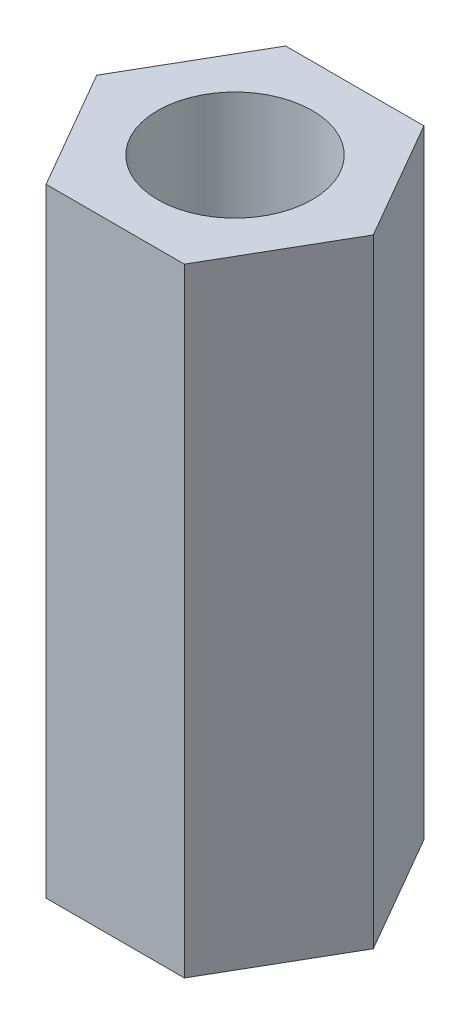
ISO-10303-21;
HEADER;
FILE_DESCRIPTION(('STEP AP214'),'2;1');
FILE_NAME('part.step','',(''),(''),'','','');
FILE_SCHEMA(('AUTOMOTIVE_DESIGN { 1 0 10303 214 1 1 1 1 }'));
ENDSEC;
DATA;
#1=APPLICATION_CONTEXT('core data for automotive mechanical design processes');
#2=APPLICATION_PROTOCOL_DEFINITION('international standard','automotive_design',2000,#1);
#3=PRODUCT_CONTEXT('',#1,'mechanical');
#4=PRODUCT('Part','Part','',(#3));
#5=PRODUCT_RELATED_PRODUCT_CATEGORY('part','',(#4));
#6=PRODUCT_DEFINITION_FORMATION('','',#4);
#7=PRODUCT_DEFINITION_CONTEXT('part definition',#1,'design');
#8=PRODUCT_DEFINITION('design','',#6,#7);
#9=PRODUCT_DEFINITION_SHAPE('','',#8);
#10=(LENGTH_UNIT() NAMED_UNIT(*) SI_UNIT(.MILLI.,.METRE.));
#11=(NAMED_UNIT(*) PLANE_ANGLE_UNIT() SI_UNIT($,.RADIAN.));
#12=(NAMED_UNIT(*) SI_UNIT($,.STERADIAN.) SOLID_ANGLE_UNIT());
#13=UNCERTAINTY_MEASURE_WITH_UNIT(LENGTH_MEASURE(1.E-05),#10,'distance_accuracy_value','');
#14=(GEOMETRIC_REPRESENTATION_CONTEXT(3) GLOBAL_UNCERTAINTY_ASSIGNED_CONTEXT((#13)) GLOBAL_UNIT_ASSIGNED_CONTEXT((#10,
#11,#12)) REPRESENTATION_CONTEXT('',''));
#15=CARTESIAN_POINT('',(0.,0.,0.));
#16=DIRECTION('',(0.,0.,1.));
#17=DIRECTION('',(1.,0.,0.));
#18=AXIS2_PLACEMENT_3D('',#15,#16,#17);
#19=CARTESIAN_POINT('',(0.,12.,0.));
#20=DIRECTION('',(0.,1.,0.));
#21=DIRECTION('',(0.,0.,1.));
#22=AXIS2_PLACEMENT_3D('',#19,#20,#21);
#23=PLANE('',#22);
#24=DIRECTION('',(0.5,0.,-0.866025403784439));
#25=VECTOR('',#24,1.);
#26=CARTESIAN_POINT('',(1.34233937586588,12.,2.325));
#27=LINE('',#26,#25);
#28=CARTESIAN_POINT('',(1.34233937586588,12.,2.325));
#29=VERTEX_POINT('',#28);
#30=CARTESIAN_POINT('',(2.68467875173176,12.,0.));
#31=VERTEX_POINT('',#30);
#32=EDGE_CURVE('E132',#29,#31,#27,.T.);
#33=ORIENTED_EDGE('',*,*,#32,.T.);
#34=DIRECTION('',(-0.5,0.,-0.866025403784438));
#35=VECTOR('',#34,1.);
#36=CARTESIAN_POINT('',(2.68467875173176,12.,0.));
#37=LINE('',#36,#35);
#38=CARTESIAN_POINT('',(1.34233937586588,12.,-2.325));
#39=VERTEX_POINT('',#38);
#40=EDGE_CURVE('E90',#31,#39,#37,.T.);
#41=ORIENTED_EDGE('',*,*,#40,.T.);
#42=DIRECTION('',(-1.,0.,0.));
#43=VECTOR('',#42,1.);
#44=CARTESIAN_POINT('',(1.34233937586588,12.,-2.325));
#45=LINE('',#44,#43);
#46=CARTESIAN_POINT('',(-1.34233937586588,12.,-2.325));
#47=VERTEX_POINT('',#46);
#48=EDGE_CURVE('E103',#39,#47,#45,.T.);
#49=ORIENTED_EDGE('',*,*,#48,.T.);
#50=DIRECTION('',(-0.5,0.,0.866025403784439));
#51=VECTOR('',#50,1.);
#52=CARTESIAN_POINT('',(-1.34233937586588,12.,-2.325));
#53=LINE('',#52,#51);
#54=CARTESIAN_POINT('',(-2.68467875173176,12.,0.));
#55=VERTEX_POINT('',#54);
#56=EDGE_CURVE('E97',#47,#55,#53,.T.);
#57=ORIENTED_EDGE('',*,*,#56,.T.);
#58=DIRECTION('',(0.5,0.,0.866025403784438));
#59=VECTOR('',#58,1.);
#60=CARTESIAN_POINT('',(-2.68467875173176,12.,0.));
#61=LINE('',#60,#59);
#62=CARTESIAN_POINT('',(-1.34233937586588,12.,2.325));
#63=VERTEX_POINT('',#62);
#64=EDGE_CURVE('E101',#55,#63,#61,.T.);
#65=ORIENTED_EDGE('',*,*,#64,.T.);
#66=DIRECTION('',(1.,0.,0.));
#67=VECTOR('',#66,1.);
#68=CARTESIAN_POINT('',(-1.34233937586588,12.,2.325));
#69=LINE('',#68,#67);
#70=EDGE_CURVE('E53',#63,#29,#69,.T.);
#71=ORIENTED_EDGE('',*,*,#70,.T.);
#72=EDGE_LOOP('',(#33,#41,#49,#57,#65,#71));
#73=FACE_BOUND('',#72,.T.);
#74=CARTESIAN_POINT('',(0.,12.,0.));
#75=DIRECTION('',(0.,1.,0.));
#76=DIRECTION('',(0.,0.,1.));
#77=AXIS2_PLACEMENT_3D('',#74,#75,#76);
#78=CIRCLE('',#77,1.5);
#79=CARTESIAN_POINT('',(0.,12.,1.5));
#80=VERTEX_POINT('',#79);
#81=EDGE_CURVE('E125',#80,#80,#78,.T.);
#82=ORIENTED_EDGE('',*,*,#81,.F.);
#83=EDGE_LOOP('',(#82));
#84=FACE_BOUND('',#83,.T.);
#85=ADVANCED_FACE('F36',(#73,#84),#23,.T.);
#86=CARTESIAN_POINT('',(0.,0.,0.));
#87=DIRECTION('',(0.,1.,0.));
#88=DIRECTION('',(0.,0.,1.));
#89=AXIS2_PLACEMENT_3D('',#86,#87,#88);
#90=PLANE('',#89);
#91=DIRECTION('',(0.5,0.,-0.866025403784439));
#92=VECTOR('',#91,1.);
#93=CARTESIAN_POINT('',(1.34233937586588,0.,2.325));
#94=LINE('',#93,#92);
#95=CARTESIAN_POINT('',(1.34233937586588,0.,2.325));
#96=VERTEX_POINT('',#95);
#97=CARTESIAN_POINT('',(2.68467875173176,0.,0.));
#98=VERTEX_POINT('',#97);
#99=EDGE_CURVE('E121',#96,#98,#94,.T.);
#100=ORIENTED_EDGE('',*,*,#99,.F.);
#101=DIRECTION('',(1.,0.,0.));
#102=VECTOR('',#101,1.);
#103=CARTESIAN_POINT('',(-1.34233937586588,0.,2.325));
#104=LINE('',#103,#102);
#105=CARTESIAN_POINT('',(-1.34233937586588,0.,2.325));
#106=VERTEX_POINT('',#105);
#107=EDGE_CURVE('E82',#106,#96,#104,.T.);
#108=ORIENTED_EDGE('',*,*,#107,.F.);
#109=DIRECTION('',(0.5,0.,0.866025403784438));
#110=VECTOR('',#109,1.);
#111=CARTESIAN_POINT('',(-2.68467875173176,0.,0.));
#112=LINE('',#111,#110);
#113=CARTESIAN_POINT('',(-2.68467875173176,0.,0.));
#114=VERTEX_POINT('',#113);
#115=EDGE_CURVE('E76',#114,#106,#112,.T.);
#116=ORIENTED_EDGE('',*,*,#115,.F.);
#117=DIRECTION('',(-0.5,0.,0.866025403784439));
#118=VECTOR('',#117,1.);
#119=CARTESIAN_POINT('',(-1.34233937586588,0.,-2.325));
#120=LINE('',#119,#118);
#121=CARTESIAN_POINT('',(-1.34233937586588,0.,-2.325));
#122=VERTEX_POINT('',#121);
#123=EDGE_CURVE('E111',#122,#114,#120,.T.);
#124=ORIENTED_EDGE('',*,*,#123,.F.);
#125=DIRECTION('',(-1.,0.,0.));
#126=VECTOR('',#125,1.);
#127=CARTESIAN_POINT('',(1.34233937586588,0.,-2.325));
#128=LINE('',#127,#126);
#129=CARTESIAN_POINT('',(1.34233937586588,0.,-2.325));
#130=VERTEX_POINT('',#129);
#131=EDGE_CURVE('E127',#130,#122,#128,.T.);
#132=ORIENTED_EDGE('',*,*,#131,.F.);
#133=DIRECTION('',(-0.5,0.,-0.866025403784438));
#134=VECTOR('',#133,1.);
#135=CARTESIAN_POINT('',(2.68467875173176,0.,0.));
#136=LINE('',#135,#134);
#137=EDGE_CURVE('E124',#98,#130,#136,.T.);
#138=ORIENTED_EDGE('',*,*,#137,.F.);
#139=EDGE_LOOP('',(#100,#108,#116,#124,#132,#138));
#140=FACE_BOUND('',#139,.T.);
#141=CARTESIAN_POINT('',(0.,0.,0.));
#142=DIRECTION('',(0.,1.,0.));
#143=DIRECTION('',(0.,0.,1.));
#144=AXIS2_PLACEMENT_3D('',#141,#142,#143);
#145=CIRCLE('',#144,1.5);
#146=CARTESIAN_POINT('',(0.,0.,1.5));
#147=VERTEX_POINT('',#146);
#148=EDGE_CURVE('E227',#147,#147,#145,.T.);
#149=ORIENTED_EDGE('',*,*,#148,.T.);
#150=EDGE_LOOP('',(#149));
#151=FACE_BOUND('',#150,.T.);
#152=ADVANCED_FACE('F141',(#140,#151),#90,.F.);
#153=CARTESIAN_POINT('',(1.34233937586588,12.,2.325));
#154=DIRECTION('',(-0.866025403784439,0.,-0.5));
#155=DIRECTION('',(-0.5,0.,0.866025403784439));
#156=AXIS2_PLACEMENT_3D('',#153,#154,#155);
#157=PLANE('',#156);
#158=ORIENTED_EDGE('',*,*,#99,.T.);
#159=DIRECTION('',(0.,-1.,0.));
#160=VECTOR('',#159,1.);
#161=CARTESIAN_POINT('',(2.68467875173176,12.,0.));
#162=LINE('',#161,#160);
#163=EDGE_CURVE('E11',#31,#98,#162,.T.);
#164=ORIENTED_EDGE('',*,*,#163,.F.);
#165=ORIENTED_EDGE('',*,*,#32,.F.);
#166=DIRECTION('',(0.,-1.,0.));
#167=VECTOR('',#166,1.);
#168=CARTESIAN_POINT('',(1.34233937586588,12.,2.325));
#169=LINE('',#168,#167);
#170=EDGE_CURVE('E117',#29,#96,#169,.T.);
#171=ORIENTED_EDGE('',*,*,#170,.T.);
#172=EDGE_LOOP('',(#158,#164,#165,#171));
#173=FACE_BOUND('',#172,.T.);
#174=ADVANCED_FACE('F38',(#173),#157,.F.);
#175=CARTESIAN_POINT('',(2.68467875173176,12.,0.));
#176=DIRECTION('',(-0.866025403784438,0.,0.5));
#177=DIRECTION('',(0.5,0.,0.866025403784439));
#178=AXIS2_PLACEMENT_3D('',#175,#176,#177);
#179=PLANE('',#178);
#180=ORIENTED_EDGE('',*,*,#137,.T.);
#181=DIRECTION('',(0.,-1.,0.));
#182=VECTOR('',#181,1.);
#183=CARTESIAN_POINT('',(1.34233937586588,12.,-2.325));
#184=LINE('',#183,#182);
#185=EDGE_CURVE('E45',#39,#130,#184,.T.);
#186=ORIENTED_EDGE('',*,*,#185,.F.);
#187=ORIENTED_EDGE('',*,*,#40,.F.);
#188=ORIENTED_EDGE('',*,*,#163,.T.);
#189=EDGE_LOOP('',(#180,#186,#187,#188));
#190=FACE_BOUND('',#189,.T.);
#191=ADVANCED_FACE('F166',(#190),#179,.F.);
#192=CARTESIAN_POINT('',(1.34233937586588,12.,-2.325));
#193=DIRECTION('',(0.,0.,1.));
#194=DIRECTION('',(1.,0.,0.));
#195=AXIS2_PLACEMENT_3D('',#192,#193,#194);
#196=PLANE('',#195);
#197=ORIENTED_EDGE('',*,*,#131,.T.);
#198=DIRECTION('',(0.,-1.,0.));
#199=VECTOR('',#198,1.);
#200=CARTESIAN_POINT('',(-1.34233937586588,12.,-2.325));
#201=LINE('',#200,#199);
#202=EDGE_CURVE('E112',#47,#122,#201,.T.);
#203=ORIENTED_EDGE('',*,*,#202,.F.);
#204=ORIENTED_EDGE('',*,*,#48,.F.);
#205=ORIENTED_EDGE('',*,*,#185,.T.);
#206=EDGE_LOOP('',(#197,#203,#204,#205));
#207=FACE_BOUND('',#206,.T.);
#208=ADVANCED_FACE('F138',(#207),#196,.F.);
#209=CARTESIAN_POINT('',(-1.34233937586588,12.,-2.325));
#210=DIRECTION('',(0.866025403784439,0.,0.5));
#211=DIRECTION('',(0.5,0.,-0.866025403784439));
#212=AXIS2_PLACEMENT_3D('',#209,#210,#211);
#213=PLANE('',#212);
#214=ORIENTED_EDGE('',*,*,#123,.T.);
#215=DIRECTION('',(0.,-1.,0.));
#216=VECTOR('',#215,1.);
#217=CARTESIAN_POINT('',(-2.68467875173176,12.,0.));
#218=LINE('',#217,#216);
#219=EDGE_CURVE('E108',#55,#114,#218,.T.);
#220=ORIENTED_EDGE('',*,*,#219,.F.);
#221=ORIENTED_EDGE('',*,*,#56,.F.);
#222=ORIENTED_EDGE('',*,*,#202,.T.);
#223=EDGE_LOOP('',(#214,#220,#221,#222));
#224=FACE_BOUND('',#223,.T.);
#225=ADVANCED_FACE('F109',(#224),#213,.F.);
#226=CARTESIAN_POINT('',(-2.68467875173176,12.,0.));
#227=DIRECTION('',(0.866025403784438,0.,-0.5));
#228=DIRECTION('',(-0.5,0.,-0.866025403784439));
#229=AXIS2_PLACEMENT_3D('',#226,#227,#228);
#230=PLANE('',#229);
#231=ORIENTED_EDGE('',*,*,#115,.T.);
#232=DIRECTION('',(0.,-1.,0.));
#233=VECTOR('',#232,1.);
#234=CARTESIAN_POINT('',(-1.34233937586588,12.,2.325));
#235=LINE('',#234,#233);
#236=EDGE_CURVE('E113',#63,#106,#235,.T.);
#237=ORIENTED_EDGE('',*,*,#236,.F.);
#238=ORIENTED_EDGE('',*,*,#64,.F.);
#239=ORIENTED_EDGE('',*,*,#219,.T.);
#240=EDGE_LOOP('',(#231,#237,#238,#239));
#241=FACE_BOUND('',#240,.T.);
#242=ADVANCED_FACE('F115',(#241),#230,.F.);
#243=CARTESIAN_POINT('',(-1.34233937586588,12.,2.325));
#244=DIRECTION('',(0.,0.,-1.));
#245=DIRECTION('',(-1.,0.,0.));
#246=AXIS2_PLACEMENT_3D('',#243,#244,#245);
#247=PLANE('',#246);
#248=ORIENTED_EDGE('',*,*,#107,.T.);
#249=ORIENTED_EDGE('',*,*,#170,.F.);
#250=ORIENTED_EDGE('',*,*,#70,.F.);
#251=ORIENTED_EDGE('',*,*,#236,.T.);
#252=EDGE_LOOP('',(#248,#249,#250,#251));
#253=FACE_BOUND('',#252,.T.);
#254=ADVANCED_FACE('F146',(#253),#247,.F.);
#255=CARTESIAN_POINT('',(0.,12.,0.));
#256=DIRECTION('',(0.,-1.,0.));
#257=DIRECTION('',(0.,0.,-1.));
#258=AXIS2_PLACEMENT_3D('',#255,#256,#257);
#259=CYLINDRICAL_SURFACE('',#258,1.5);
#260=ORIENTED_EDGE('',*,*,#81,.T.);
#261=EDGE_LOOP('',(#260));
#262=FACE_BOUND('',#261,.T.);
#263=ORIENTED_EDGE('',*,*,#148,.F.);
#264=EDGE_LOOP('',(#263));
#265=FACE_BOUND('',#264,.T.);
#266=ADVANCED_FACE('F148',(#262,#265),#259,.F.);
#267=CLOSED_SHELL('',(#85,#152,#174,#191,#208,#225,#242,#254,#266));
#268=MANIFOLD_SOLID_BREP('B2',#267);
#269=ADVANCED_BREP_SHAPE_REPRESENTATION('',(#18,#268),#14);
#270=SHAPE_DEFINITION_REPRESENTATION(#9,#269);
ENDSEC;
END-ISO-10303-21;
